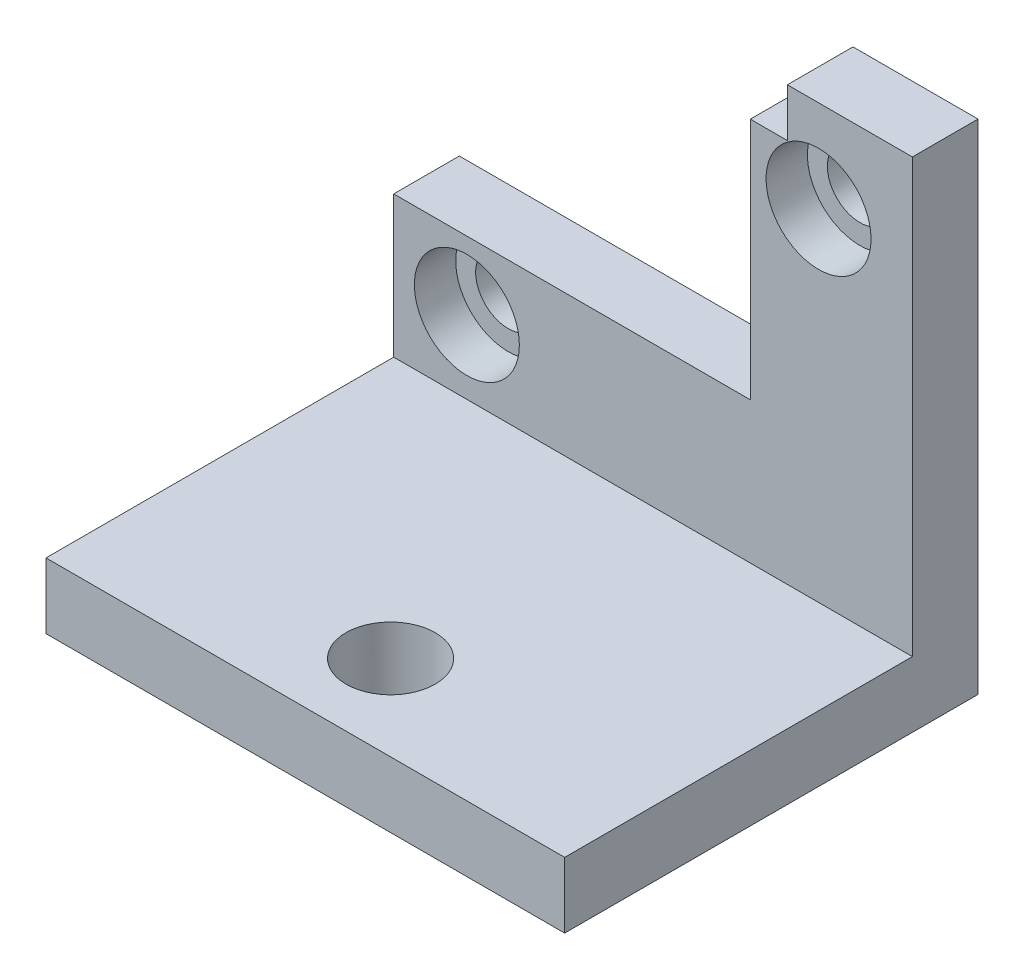
ISO-10303-21;
HEADER;
FILE_DESCRIPTION(('STEP AP214'),'2;1');
FILE_NAME('part.step','',(''),(''),'','','');
FILE_SCHEMA(('AUTOMOTIVE_DESIGN { 1 0 10303 214 1 1 1 1 }'));
ENDSEC;
DATA;
#1=APPLICATION_CONTEXT('core data for automotive mechanical design processes');
#2=APPLICATION_PROTOCOL_DEFINITION('international standard','automotive_design',2000,#1);
#3=PRODUCT_CONTEXT('',#1,'mechanical');
#4=PRODUCT('Part','Part','',(#3));
#5=PRODUCT_RELATED_PRODUCT_CATEGORY('part','',(#4));
#6=PRODUCT_DEFINITION_FORMATION('','',#4);
#7=PRODUCT_DEFINITION_CONTEXT('part definition',#1,'design');
#8=PRODUCT_DEFINITION('design','',#6,#7);
#9=PRODUCT_DEFINITION_SHAPE('','',#8);
#10=(LENGTH_UNIT() NAMED_UNIT(*) SI_UNIT(.MILLI.,.METRE.));
#11=(NAMED_UNIT(*) PLANE_ANGLE_UNIT() SI_UNIT($,.RADIAN.));
#12=(NAMED_UNIT(*) SI_UNIT($,.STERADIAN.) SOLID_ANGLE_UNIT());
#13=UNCERTAINTY_MEASURE_WITH_UNIT(LENGTH_MEASURE(1.E-05),#10,'distance_accuracy_value','');
#14=(GEOMETRIC_REPRESENTATION_CONTEXT(3) GLOBAL_UNCERTAINTY_ASSIGNED_CONTEXT((#13)) GLOBAL_UNIT_ASSIGNED_CONTEXT((#10,
#11,#12)) REPRESENTATION_CONTEXT('',''));
#15=CARTESIAN_POINT('',(0.,0.,0.));
#16=DIRECTION('',(0.,0.,1.));
#17=DIRECTION('',(1.,0.,0.));
#18=AXIS2_PLACEMENT_3D('',#15,#16,#17);
#19=CARTESIAN_POINT('',(-9.32078617099483,-4.74040490381666,3.175));
#20=DIRECTION('',(0.,0.,-1.));
#21=DIRECTION('',(-1.,0.,0.));
#22=AXIS2_PLACEMENT_3D('',#19,#20,#21);
#23=CYLINDRICAL_SURFACE('',#22,1.5748);
#24=CARTESIAN_POINT('',(-9.32078617099483,-4.74040490381666,0.));
#25=DIRECTION('',(0.,0.,1.));
#26=DIRECTION('',(1.,0.,0.));
#27=AXIS2_PLACEMENT_3D('',#24,#25,#26);
#28=CIRCLE('',#27,1.5748);
#29=CARTESIAN_POINT('',(-7.74598617099483,-4.74040490381666,0.));
#30=VERTEX_POINT('',#29);
#31=EDGE_CURVE('E284',#30,#30,#28,.T.);
#32=ORIENTED_EDGE('',*,*,#31,.F.);
#33=EDGE_LOOP('',(#32));
#34=FACE_BOUND('',#33,.T.);
#35=CARTESIAN_POINT('',(-9.32078617099483,-4.74040490381666,1.175));
#36=DIRECTION('',(0.,0.,1.));
#37=DIRECTION('',(1.,0.,0.));
#38=AXIS2_PLACEMENT_3D('',#35,#36,#37);
#39=CIRCLE('',#38,1.5748);
#40=CARTESIAN_POINT('',(-7.74598617099483,-4.74040490381666,1.175));
#41=VERTEX_POINT('',#40);
#42=EDGE_CURVE('E147',#41,#41,#39,.T.);
#43=ORIENTED_EDGE('',*,*,#42,.T.);
#44=EDGE_LOOP('',(#43));
#45=FACE_BOUND('',#44,.T.);
#46=ADVANCED_FACE('F143',(#34,#45),#23,.F.);
#47=CARTESIAN_POINT('',(7.69721382900516,8.21359509618334,3.175));
#48=DIRECTION('',(0.,0.,-1.));
#49=DIRECTION('',(-1.,0.,0.));
#50=AXIS2_PLACEMENT_3D('',#47,#48,#49);
#51=CYLINDRICAL_SURFACE('',#50,1.5748);
#52=CARTESIAN_POINT('',(7.69721382900516,8.21359509618334,0.));
#53=DIRECTION('',(0.,0.,1.));
#54=DIRECTION('',(1.,0.,0.));
#55=AXIS2_PLACEMENT_3D('',#52,#53,#54);
#56=CIRCLE('',#55,1.5748);
#57=CARTESIAN_POINT('',(9.27201382900516,8.21359509618334,0.));
#58=VERTEX_POINT('',#57);
#59=EDGE_CURVE('E299',#58,#58,#56,.T.);
#60=ORIENTED_EDGE('',*,*,#59,.F.);
#61=EDGE_LOOP('',(#60));
#62=FACE_BOUND('',#61,.T.);
#63=CARTESIAN_POINT('',(7.69721382900516,8.21359509618334,1.175));
#64=DIRECTION('',(0.,0.,1.));
#65=DIRECTION('',(1.,0.,0.));
#66=AXIS2_PLACEMENT_3D('',#63,#64,#65);
#67=CIRCLE('',#66,1.5748);
#68=CARTESIAN_POINT('',(9.27201382900516,8.21359509618334,1.175));
#69=VERTEX_POINT('',#68);
#70=EDGE_CURVE('E240',#69,#69,#67,.T.);
#71=ORIENTED_EDGE('',*,*,#70,.T.);
#72=EDGE_LOOP('',(#71));
#73=FACE_BOUND('',#72,.T.);
#74=ADVANCED_FACE('F377',(#62,#73),#51,.F.);
#75=CARTESIAN_POINT('',(0.,-1.43840490381666,3.175));
#76=DIRECTION('',(0.,-1.,0.));
#77=DIRECTION('',(1.,0.,0.));
#78=AXIS2_PLACEMENT_3D('',#75,#76,#77);
#79=PLANE('',#78);
#80=DIRECTION('',(-1.,0.,0.));
#81=VECTOR('',#80,1.);
#82=CARTESIAN_POINT('',(0.,-1.43840490381666,0.));
#83=LINE('',#82,#81);
#84=CARTESIAN_POINT('',(4.39521382900517,-1.43840490381666,0.));
#85=VERTEX_POINT('',#84);
#86=CARTESIAN_POINT('',(-12.8607861709948,-1.43840490381666,0.));
#87=VERTEX_POINT('',#86);
#88=EDGE_CURVE('E204',#85,#87,#83,.T.);
#89=ORIENTED_EDGE('',*,*,#88,.T.);
#90=DIRECTION('',(0.,0.,-1.));
#91=VECTOR('',#90,1.);
#92=CARTESIAN_POINT('',(-12.8607861709948,-1.43840490381666,3.175));
#93=LINE('',#92,#91);
#94=CARTESIAN_POINT('',(-12.8607861709948,-1.43840490381666,3.175));
#95=VERTEX_POINT('',#94);
#96=EDGE_CURVE('E12',#95,#87,#93,.T.);
#97=ORIENTED_EDGE('',*,*,#96,.F.);
#98=DIRECTION('',(-1.,0.,0.));
#99=VECTOR('',#98,1.);
#100=CARTESIAN_POINT('',(0.,-1.43840490381666,3.175));
#101=LINE('',#100,#99);
#102=CARTESIAN_POINT('',(4.39521382900517,-1.43840490381666,3.175));
#103=VERTEX_POINT('',#102);
#104=EDGE_CURVE('E226',#103,#95,#101,.T.);
#105=ORIENTED_EDGE('',*,*,#104,.F.);
#106=DIRECTION('',(0.,0.,-1.));
#107=VECTOR('',#106,1.);
#108=CARTESIAN_POINT('',(4.39521382900517,-1.43840490381666,3.175));
#109=LINE('',#108,#107);
#110=EDGE_CURVE('E219',#103,#85,#109,.T.);
#111=ORIENTED_EDGE('',*,*,#110,.T.);
#112=EDGE_LOOP('',(#89,#97,#105,#111));
#113=FACE_BOUND('',#112,.T.);
#114=ADVANCED_FACE('F225',(#113),#79,.F.);
#115=CARTESIAN_POINT('',(-12.8607861709948,0.,3.175));
#116=DIRECTION('',(1.,0.,0.));
#117=DIRECTION('',(0.,0.,-1.));
#118=AXIS2_PLACEMENT_3D('',#115,#116,#117);
#119=PLANE('',#118);
#120=DIRECTION('',(0.,-1.,0.));
#121=VECTOR('',#120,1.);
#122=CARTESIAN_POINT('',(-12.8607861709948,0.,0.));
#123=LINE('',#122,#121);
#124=CARTESIAN_POINT('',(-12.8607861709948,-11.4554049038167,0.));
#125=VERTEX_POINT('',#124);
#126=EDGE_CURVE('E209',#87,#125,#123,.T.);
#127=ORIENTED_EDGE('',*,*,#126,.T.);
#128=DIRECTION('',(0.,0.,-1.));
#129=VECTOR('',#128,1.);
#130=CARTESIAN_POINT('',(-12.8607861709948,-11.4554049038167,20.));
#131=LINE('',#130,#129);
#132=CARTESIAN_POINT('',(-12.8607861709948,-11.4554049038167,20.));
#133=VERTEX_POINT('',#132);
#134=EDGE_CURVE('E287',#133,#125,#131,.T.);
#135=ORIENTED_EDGE('',*,*,#134,.F.);
#136=DIRECTION('',(0.,1.,0.));
#137=VECTOR('',#136,1.);
#138=CARTESIAN_POINT('',(-12.8607861709948,-8.28040490381666,20.));
#139=LINE('',#138,#137);
#140=CARTESIAN_POINT('',(-12.8607861709948,-8.28040490381666,20.));
#141=VERTEX_POINT('',#140);
#142=EDGE_CURVE('E273',#133,#141,#139,.T.);
#143=ORIENTED_EDGE('',*,*,#142,.T.);
#144=DIRECTION('',(0.,0.,-1.));
#145=VECTOR('',#144,1.);
#146=CARTESIAN_POINT('',(-12.8607861709948,-8.28040490381666,20.));
#147=LINE('',#146,#145);
#148=CARTESIAN_POINT('',(-12.8607861709948,-8.28040490381666,3.175));
#149=VERTEX_POINT('',#148);
#150=EDGE_CURVE('E285',#141,#149,#147,.T.);
#151=ORIENTED_EDGE('',*,*,#150,.T.);
#152=DIRECTION('',(0.,-1.,0.));
#153=VECTOR('',#152,1.);
#154=CARTESIAN_POINT('',(-12.8607861709948,0.,3.175));
#155=LINE('',#154,#153);
#156=EDGE_CURVE('E161',#95,#149,#155,.T.);
#157=ORIENTED_EDGE('',*,*,#156,.F.);
#158=ORIENTED_EDGE('',*,*,#96,.T.);
#159=EDGE_LOOP('',(#127,#135,#143,#151,#157,#158));
#160=FACE_BOUND('',#159,.T.);
#161=ADVANCED_FACE('F354',(#160),#119,.F.);
#162=CARTESIAN_POINT('',(0.,0.,3.175));
#163=DIRECTION('',(0.,0.,1.));
#164=DIRECTION('',(1.,0.,0.));
#165=AXIS2_PLACEMENT_3D('',#162,#163,#164);
#166=PLANE('',#165);
#167=CARTESIAN_POINT('',(7.69721382900516,8.21359509618334,3.175));
#168=DIRECTION('',(0.,0.,1.));
#169=DIRECTION('',(1.,0.,0.));
#170=AXIS2_PLACEMENT_3D('',#167,#168,#169);
#171=CIRCLE('',#170,2.54);
#172=CARTESIAN_POINT('',(10.2372138290052,8.21359509618334,3.175));
#173=VERTEX_POINT('',#172);
#174=EDGE_CURVE('E248',#173,#173,#171,.T.);
#175=ORIENTED_EDGE('',*,*,#174,.F.);
#176=EDGE_LOOP('',(#175));
#177=FACE_BOUND('',#176,.T.);
#178=CARTESIAN_POINT('',(-9.32078617099483,-4.74040490381666,3.175));
#179=DIRECTION('',(0.,0.,1.));
#180=DIRECTION('',(1.,0.,0.));
#181=AXIS2_PLACEMENT_3D('',#178,#179,#180);
#182=CIRCLE('',#181,2.54);
#183=CARTESIAN_POINT('',(-6.78078617099483,-4.74040490381666,3.175));
#184=VERTEX_POINT('',#183);
#185=EDGE_CURVE('E258',#184,#184,#182,.T.);
#186=ORIENTED_EDGE('',*,*,#185,.F.);
#187=EDGE_LOOP('',(#186));
#188=FACE_BOUND('',#187,.T.);
#189=ORIENTED_EDGE('',*,*,#104,.T.);
#190=ORIENTED_EDGE('',*,*,#156,.T.);
#191=DIRECTION('',(-1.,0.,0.));
#192=VECTOR('',#191,1.);
#193=CARTESIAN_POINT('',(0.,-8.28040490381666,3.175));
#194=LINE('',#193,#192);
#195=CARTESIAN_POINT('',(12.2372138290052,-8.28040490381666,3.175));
#196=VERTEX_POINT('',#195);
#197=EDGE_CURVE('E153',#196,#149,#194,.T.);
#198=ORIENTED_EDGE('',*,*,#197,.F.);
#199=DIRECTION('',(0.,1.,0.));
#200=VECTOR('',#199,1.);
#201=CARTESIAN_POINT('',(12.2372138290052,-8.28040490381666,3.175));
#202=LINE('',#201,#200);
#203=CARTESIAN_POINT('',(12.2372138290052,12.6585950961833,3.175));
#204=VERTEX_POINT('',#203);
#205=EDGE_CURVE('E222',#196,#204,#202,.T.);
#206=ORIENTED_EDGE('',*,*,#205,.T.);
#207=DIRECTION('',(-1.,0.,0.));
#208=VECTOR('',#207,1.);
#209=CARTESIAN_POINT('',(12.2372138290052,12.6585950961833,3.175));
#210=LINE('',#209,#208);
#211=CARTESIAN_POINT('',(6.18817038186677,12.6585950961833,3.175));
#212=VERTEX_POINT('',#211);
#213=EDGE_CURVE('E304',#204,#212,#210,.T.);
#214=ORIENTED_EDGE('',*,*,#213,.T.);
#215=DIRECTION('',(0.,1.,0.));
#216=VECTOR('',#215,1.);
#217=CARTESIAN_POINT('',(6.18817038186677,10.3218119533511,3.175));
#218=LINE('',#217,#216);
#219=CARTESIAN_POINT('',(6.18817038186677,10.3218119533511,3.175));
#220=VERTEX_POINT('',#219);
#221=EDGE_CURVE('E306',#220,#212,#218,.T.);
#222=ORIENTED_EDGE('',*,*,#221,.F.);
#223=DIRECTION('',(1.,0.,0.));
#224=VECTOR('',#223,1.);
#225=CARTESIAN_POINT('',(4.39521382900517,10.3218119533511,3.175));
#226=LINE('',#225,#224);
#227=CARTESIAN_POINT('',(4.39521382900517,10.3218119533511,3.175));
#228=VERTEX_POINT('',#227);
#229=EDGE_CURVE('E232',#228,#220,#226,.T.);
#230=ORIENTED_EDGE('',*,*,#229,.F.);
#231=DIRECTION('',(0.,-1.,0.));
#232=VECTOR('',#231,1.);
#233=CARTESIAN_POINT('',(4.39521382900517,10.3218119533511,3.175));
#234=LINE('',#233,#232);
#235=EDGE_CURVE('E228',#228,#103,#234,.T.);
#236=ORIENTED_EDGE('',*,*,#235,.T.);
#237=EDGE_LOOP('',(#189,#190,#198,#206,#214,#222,#230,#236));
#238=FACE_BOUND('',#237,.T.);
#239=ADVANCED_FACE('F361',(#177,#188,#238),#166,.T.);
#240=CARTESIAN_POINT('',(0.,0.,0.));
#241=DIRECTION('',(0.,0.,1.));
#242=DIRECTION('',(1.,0.,0.));
#243=AXIS2_PLACEMENT_3D('',#240,#241,#242);
#244=PLANE('',#243);
#245=ORIENTED_EDGE('',*,*,#88,.F.);
#246=DIRECTION('',(0.,-1.,0.));
#247=VECTOR('',#246,1.);
#248=CARTESIAN_POINT('',(4.39521382900517,7.82738812093123,0.));
#249=LINE('',#248,#247);
#250=CARTESIAN_POINT('',(4.39521382900517,10.3218119533511,0.));
#251=VERTEX_POINT('',#250);
#252=EDGE_CURVE('E201',#251,#85,#249,.T.);
#253=ORIENTED_EDGE('',*,*,#252,.F.);
#254=DIRECTION('',(1.,0.,0.));
#255=VECTOR('',#254,1.);
#256=CARTESIAN_POINT('',(4.39521382900517,10.3218119533511,0.));
#257=LINE('',#256,#255);
#258=CARTESIAN_POINT('',(6.18817038186677,10.3218119533511,0.));
#259=VERTEX_POINT('',#258);
#260=EDGE_CURVE('E223',#251,#259,#257,.T.);
#261=ORIENTED_EDGE('',*,*,#260,.T.);
#262=DIRECTION('',(0.,1.,0.));
#263=VECTOR('',#262,1.);
#264=CARTESIAN_POINT('',(6.18817038186677,10.3218119533511,0.));
#265=LINE('',#264,#263);
#266=CARTESIAN_POINT('',(6.18817038186677,12.6585950961833,0.));
#267=VERTEX_POINT('',#266);
#268=EDGE_CURVE('E316',#259,#267,#265,.T.);
#269=ORIENTED_EDGE('',*,*,#268,.T.);
#270=DIRECTION('',(-1.,0.,0.));
#271=VECTOR('',#270,1.);
#272=CARTESIAN_POINT('',(7.69721382900516,12.6585950961833,0.));
#273=LINE('',#272,#271);
#274=CARTESIAN_POINT('',(12.2372138290052,12.6585950961833,0.));
#275=VERTEX_POINT('',#274);
#276=EDGE_CURVE('E313',#275,#267,#273,.T.);
#277=ORIENTED_EDGE('',*,*,#276,.F.);
#278=DIRECTION('',(0.,1.,0.));
#279=VECTOR('',#278,1.);
#280=CARTESIAN_POINT('',(12.2372138290052,-8.28040490381666,0.));
#281=LINE('',#280,#279);
#282=CARTESIAN_POINT('',(12.2372138290052,-11.4554049038167,0.));
#283=VERTEX_POINT('',#282);
#284=EDGE_CURVE('E302',#283,#275,#281,.T.);
#285=ORIENTED_EDGE('',*,*,#284,.F.);
#286=DIRECTION('',(-1.,0.,0.));
#287=VECTOR('',#286,1.);
#288=CARTESIAN_POINT('',(12.2372138290052,-11.4554049038167,0.));
#289=LINE('',#288,#287);
#290=EDGE_CURVE('E266',#283,#125,#289,.T.);
#291=ORIENTED_EDGE('',*,*,#290,.T.);
#292=ORIENTED_EDGE('',*,*,#126,.F.);
#293=EDGE_LOOP('',(#245,#253,#261,#269,#277,#285,#291,#292));
#294=FACE_BOUND('',#293,.T.);
#295=ORIENTED_EDGE('',*,*,#59,.T.);
#296=EDGE_LOOP('',(#295));
#297=FACE_BOUND('',#296,.T.);
#298=ORIENTED_EDGE('',*,*,#31,.T.);
#299=EDGE_LOOP('',(#298));
#300=FACE_BOUND('',#299,.T.);
#301=ADVANCED_FACE('F205',(#294,#297,#300),#244,.F.);
#302=CARTESIAN_POINT('',(4.39521382900517,7.82738812093123,3.175));
#303=DIRECTION('',(1.,0.,0.));
#304=DIRECTION('',(0.,0.,-1.));
#305=AXIS2_PLACEMENT_3D('',#302,#303,#304);
#306=PLANE('',#305);
#307=ORIENTED_EDGE('',*,*,#252,.T.);
#308=ORIENTED_EDGE('',*,*,#110,.F.);
#309=ORIENTED_EDGE('',*,*,#235,.F.);
#310=DIRECTION('',(0.,0.,-1.));
#311=VECTOR('',#310,1.);
#312=CARTESIAN_POINT('',(4.39521382900517,10.3218119533511,3.175));
#313=LINE('',#312,#311);
#314=EDGE_CURVE('E220',#228,#251,#313,.T.);
#315=ORIENTED_EDGE('',*,*,#314,.T.);
#316=EDGE_LOOP('',(#307,#308,#309,#315));
#317=FACE_BOUND('',#316,.T.);
#318=ADVANCED_FACE('F217',(#317),#306,.F.);
#319=CARTESIAN_POINT('',(4.39521382900517,10.3218119533511,3.175));
#320=DIRECTION('',(0.,1.,0.));
#321=DIRECTION('',(0.,0.,1.));
#322=AXIS2_PLACEMENT_3D('',#319,#320,#321);
#323=PLANE('',#322);
#324=ORIENTED_EDGE('',*,*,#260,.F.);
#325=ORIENTED_EDGE('',*,*,#314,.F.);
#326=ORIENTED_EDGE('',*,*,#229,.T.);
#327=DIRECTION('',(0.,0.,-1.));
#328=VECTOR('',#327,1.);
#329=CARTESIAN_POINT('',(6.18817038186677,10.3218119533511,3.175));
#330=LINE('',#329,#328);
#331=EDGE_CURVE('E230',#220,#259,#330,.T.);
#332=ORIENTED_EDGE('',*,*,#331,.T.);
#333=EDGE_LOOP('',(#324,#325,#326,#332));
#334=FACE_BOUND('',#333,.T.);
#335=ADVANCED_FACE('F320',(#334),#323,.T.);
#336=CARTESIAN_POINT('',(6.18817038186677,10.3218119533511,3.175));
#337=DIRECTION('',(-1.,0.,0.));
#338=DIRECTION('',(0.,0.,1.));
#339=AXIS2_PLACEMENT_3D('',#336,#337,#338);
#340=PLANE('',#339);
#341=ORIENTED_EDGE('',*,*,#268,.F.);
#342=ORIENTED_EDGE('',*,*,#331,.F.);
#343=ORIENTED_EDGE('',*,*,#221,.T.);
#344=DIRECTION('',(0.,0.,-1.));
#345=VECTOR('',#344,1.);
#346=CARTESIAN_POINT('',(6.18817038186677,12.6585950961833,3.175));
#347=LINE('',#346,#345);
#348=EDGE_CURVE('E237',#212,#267,#347,.T.);
#349=ORIENTED_EDGE('',*,*,#348,.T.);
#350=EDGE_LOOP('',(#341,#342,#343,#349));
#351=FACE_BOUND('',#350,.T.);
#352=ADVANCED_FACE('F324',(#351),#340,.T.);
#353=CARTESIAN_POINT('',(7.69721382900516,12.6585950961833,3.175));
#354=DIRECTION('',(0.,-1.,0.));
#355=DIRECTION('',(1.,0.,0.));
#356=AXIS2_PLACEMENT_3D('',#353,#354,#355);
#357=PLANE('',#356);
#358=ORIENTED_EDGE('',*,*,#276,.T.);
#359=ORIENTED_EDGE('',*,*,#348,.F.);
#360=ORIENTED_EDGE('',*,*,#213,.F.);
#361=DIRECTION('',(0.,0.,-1.));
#362=VECTOR('',#361,1.);
#363=CARTESIAN_POINT('',(12.2372138290052,12.6585950961833,3.175));
#364=LINE('',#363,#362);
#365=EDGE_CURVE('E213',#204,#275,#364,.T.);
#366=ORIENTED_EDGE('',*,*,#365,.T.);
#367=EDGE_LOOP('',(#358,#359,#360,#366));
#368=FACE_BOUND('',#367,.T.);
#369=ADVANCED_FACE('F328',(#368),#357,.F.);
#370=CARTESIAN_POINT('',(12.2372138290052,-8.28040490381666,3.175));
#371=DIRECTION('',(-1.,0.,0.));
#372=DIRECTION('',(0.,0.,1.));
#373=AXIS2_PLACEMENT_3D('',#370,#371,#372);
#374=PLANE('',#373);
#375=ORIENTED_EDGE('',*,*,#284,.T.);
#376=ORIENTED_EDGE('',*,*,#365,.F.);
#377=ORIENTED_EDGE('',*,*,#205,.F.);
#378=DIRECTION('',(0.,0.,-1.));
#379=VECTOR('',#378,1.);
#380=CARTESIAN_POINT('',(12.2372138290052,-8.28040490381666,20.));
#381=LINE('',#380,#379);
#382=CARTESIAN_POINT('',(12.2372138290052,-8.28040490381666,20.));
#383=VERTEX_POINT('',#382);
#384=EDGE_CURVE('E281',#383,#196,#381,.T.);
#385=ORIENTED_EDGE('',*,*,#384,.F.);
#386=DIRECTION('',(0.,-1.,0.));
#387=VECTOR('',#386,1.);
#388=CARTESIAN_POINT('',(12.2372138290052,-8.28040490381666,20.));
#389=LINE('',#388,#387);
#390=CARTESIAN_POINT('',(12.2372138290052,-11.4554049038167,20.));
#391=VERTEX_POINT('',#390);
#392=EDGE_CURVE('E267',#383,#391,#389,.T.);
#393=ORIENTED_EDGE('',*,*,#392,.T.);
#394=DIRECTION('',(0.,0.,-1.));
#395=VECTOR('',#394,1.);
#396=CARTESIAN_POINT('',(12.2372138290052,-11.4554049038167,20.));
#397=LINE('',#396,#395);
#398=EDGE_CURVE('E279',#391,#283,#397,.T.);
#399=ORIENTED_EDGE('',*,*,#398,.T.);
#400=EDGE_LOOP('',(#375,#376,#377,#385,#393,#399));
#401=FACE_BOUND('',#400,.T.);
#402=ADVANCED_FACE('F145',(#401),#374,.F.);
#403=CARTESIAN_POINT('',(12.2372138290052,-8.28040490381666,20.));
#404=DIRECTION('',(0.,1.,0.));
#405=DIRECTION('',(0.,0.,1.));
#406=AXIS2_PLACEMENT_3D('',#403,#404,#405);
#407=PLANE('',#406);
#408=CARTESIAN_POINT('',(-0.311786170994833,-8.28040490381666,15.875));
#409=DIRECTION('',(0.,1.,0.));
#410=DIRECTION('',(0.,0.,1.));
#411=AXIS2_PLACEMENT_3D('',#408,#409,#410);
#412=CIRCLE('',#411,2.159);
#413=CARTESIAN_POINT('',(-0.311786170994833,-8.28040490381666,18.034));
#414=VERTEX_POINT('',#413);
#415=EDGE_CURVE('E263',#414,#414,#412,.T.);
#416=ORIENTED_EDGE('',*,*,#415,.F.);
#417=EDGE_LOOP('',(#416));
#418=FACE_BOUND('',#417,.T.);
#419=ORIENTED_EDGE('',*,*,#384,.T.);
#420=ORIENTED_EDGE('',*,*,#197,.T.);
#421=ORIENTED_EDGE('',*,*,#150,.F.);
#422=DIRECTION('',(1.,0.,0.));
#423=VECTOR('',#422,1.);
#424=CARTESIAN_POINT('',(12.2372138290052,-8.28040490381666,20.));
#425=LINE('',#424,#423);
#426=EDGE_CURVE('E276',#141,#383,#425,.T.);
#427=ORIENTED_EDGE('',*,*,#426,.T.);
#428=EDGE_LOOP('',(#419,#420,#421,#427));
#429=FACE_BOUND('',#428,.T.);
#430=ADVANCED_FACE('F359',(#418,#429),#407,.T.);
#431=CARTESIAN_POINT('',(12.2372138290052,-11.4554049038167,20.));
#432=DIRECTION('',(0.,-1.,0.));
#433=DIRECTION('',(0.,0.,-1.));
#434=AXIS2_PLACEMENT_3D('',#431,#432,#433);
#435=PLANE('',#434);
#436=CARTESIAN_POINT('',(-0.311786170994833,-11.4554049038167,15.875));
#437=DIRECTION('',(0.,-1.,0.));
#438=DIRECTION('',(0.,0.,-1.));
#439=AXIS2_PLACEMENT_3D('',#436,#437,#438);
#440=CIRCLE('',#439,2.159);
#441=CARTESIAN_POINT('',(-0.311786170994833,-11.4554049038167,13.716));
#442=VERTEX_POINT('',#441);
#443=EDGE_CURVE('E246',#442,#442,#440,.T.);
#444=ORIENTED_EDGE('',*,*,#443,.F.);
#445=EDGE_LOOP('',(#444));
#446=FACE_BOUND('',#445,.T.);
#447=ORIENTED_EDGE('',*,*,#290,.F.);
#448=ORIENTED_EDGE('',*,*,#398,.F.);
#449=DIRECTION('',(-1.,0.,0.));
#450=VECTOR('',#449,1.);
#451=CARTESIAN_POINT('',(12.2372138290052,-11.4554049038167,20.));
#452=LINE('',#451,#450);
#453=EDGE_CURVE('E270',#391,#133,#452,.T.);
#454=ORIENTED_EDGE('',*,*,#453,.T.);
#455=ORIENTED_EDGE('',*,*,#134,.T.);
#456=EDGE_LOOP('',(#447,#448,#454,#455));
#457=FACE_BOUND('',#456,.T.);
#458=ADVANCED_FACE('F343',(#446,#457),#435,.T.);
#459=CARTESIAN_POINT('',(0.,0.,20.));
#460=DIRECTION('',(0.,0.,-1.));
#461=DIRECTION('',(-1.,0.,0.));
#462=AXIS2_PLACEMENT_3D('',#459,#460,#461);
#463=PLANE('',#462);
#464=ORIENTED_EDGE('',*,*,#392,.F.);
#465=ORIENTED_EDGE('',*,*,#426,.F.);
#466=ORIENTED_EDGE('',*,*,#142,.F.);
#467=ORIENTED_EDGE('',*,*,#453,.F.);
#468=EDGE_LOOP('',(#464,#465,#466,#467));
#469=FACE_BOUND('',#468,.T.);
#470=ADVANCED_FACE('F357',(#469),#463,.F.);
#471=CARTESIAN_POINT('',(-0.311786170994833,12.6585950961833,15.875));
#472=DIRECTION('',(0.,-1.,0.));
#473=DIRECTION('',(0.,0.,-1.));
#474=AXIS2_PLACEMENT_3D('',#471,#472,#473);
#475=CYLINDRICAL_SURFACE('',#474,2.159);
#476=ORIENTED_EDGE('',*,*,#415,.T.);
#477=EDGE_LOOP('',(#476));
#478=FACE_BOUND('',#477,.T.);
#479=ORIENTED_EDGE('',*,*,#443,.T.);
#480=EDGE_LOOP('',(#479));
#481=FACE_BOUND('',#480,.T.);
#482=ADVANCED_FACE('F412',(#478,#481),#475,.F.);
#483=CARTESIAN_POINT('',(7.69721382900516,8.21359509618334,1.175));
#484=DIRECTION('',(0.,0.,1.));
#485=DIRECTION('',(1.,0.,0.));
#486=AXIS2_PLACEMENT_3D('',#483,#484,#485);
#487=CYLINDRICAL_SURFACE('',#486,2.54);
#488=CARTESIAN_POINT('',(7.69721382900516,8.21359509618334,1.175));
#489=DIRECTION('',(0.,0.,1.));
#490=DIRECTION('',(1.,0.,0.));
#491=AXIS2_PLACEMENT_3D('',#488,#489,#490);
#492=CIRCLE('',#491,2.54);
#493=CARTESIAN_POINT('',(10.2372138290052,8.21359509618334,1.175));
#494=VERTEX_POINT('',#493);
#495=EDGE_CURVE('E242',#494,#494,#492,.T.);
#496=ORIENTED_EDGE('',*,*,#495,.F.);
#497=EDGE_LOOP('',(#496));
#498=FACE_BOUND('',#497,.T.);
#499=ORIENTED_EDGE('',*,*,#174,.T.);
#500=EDGE_LOOP('',(#499));
#501=FACE_BOUND('',#500,.T.);
#502=ADVANCED_FACE('F415',(#498,#501),#487,.F.);
#503=CARTESIAN_POINT('',(7.69721382900516,8.21359509618334,1.175));
#504=DIRECTION('',(0.,0.,1.));
#505=DIRECTION('',(1.,0.,0.));
#506=AXIS2_PLACEMENT_3D('',#503,#504,#505);
#507=PLANE('',#506);
#508=ORIENTED_EDGE('',*,*,#70,.F.);
#509=EDGE_LOOP('',(#508));
#510=FACE_BOUND('',#509,.T.);
#511=ORIENTED_EDGE('',*,*,#495,.T.);
#512=EDGE_LOOP('',(#511));
#513=FACE_BOUND('',#512,.T.);
#514=ADVANCED_FACE('F421',(#510,#513),#507,.T.);
#515=CARTESIAN_POINT('',(-9.32078617099483,-4.74040490381666,1.175));
#516=DIRECTION('',(0.,0.,1.));
#517=DIRECTION('',(1.,0.,0.));
#518=AXIS2_PLACEMENT_3D('',#515,#516,#517);
#519=CYLINDRICAL_SURFACE('',#518,2.54);
#520=CARTESIAN_POINT('',(-9.32078617099483,-4.74040490381666,1.175));
#521=DIRECTION('',(0.,0.,1.));
#522=DIRECTION('',(1.,0.,0.));
#523=AXIS2_PLACEMENT_3D('',#520,#521,#522);
#524=CIRCLE('',#523,2.54);
#525=CARTESIAN_POINT('',(-6.78078617099483,-4.74040490381666,1.175));
#526=VERTEX_POINT('',#525);
#527=EDGE_CURVE('E253',#526,#526,#524,.T.);
#528=ORIENTED_EDGE('',*,*,#527,.F.);
#529=EDGE_LOOP('',(#528));
#530=FACE_BOUND('',#529,.T.);
#531=ORIENTED_EDGE('',*,*,#185,.T.);
#532=EDGE_LOOP('',(#531));
#533=FACE_BOUND('',#532,.T.);
#534=ADVANCED_FACE('F417',(#530,#533),#519,.F.);
#535=CARTESIAN_POINT('',(-9.32078617099483,-4.74040490381666,1.175));
#536=DIRECTION('',(0.,0.,1.));
#537=DIRECTION('',(1.,0.,0.));
#538=AXIS2_PLACEMENT_3D('',#535,#536,#537);
#539=PLANE('',#538);
#540=ORIENTED_EDGE('',*,*,#42,.F.);
#541=EDGE_LOOP('',(#540));
#542=FACE_BOUND('',#541,.T.);
#543=ORIENTED_EDGE('',*,*,#527,.T.);
#544=EDGE_LOOP('',(#543));
#545=FACE_BOUND('',#544,.T.);
#546=ADVANCED_FACE('F420',(#542,#545),#539,.T.);
#547=CLOSED_SHELL('',(#46,#74,#114,#161,#239,#301,#318,#335,#352,#369,#402,#430,#458,#470,#482,
#502,#514,#534,#546));
#548=MANIFOLD_SOLID_BREP('B2',#547);
#549=ADVANCED_BREP_SHAPE_REPRESENTATION('',(#18,#548),#14);
#550=SHAPE_DEFINITION_REPRESENTATION(#9,#549);
ENDSEC;
END-ISO-10303-21;
